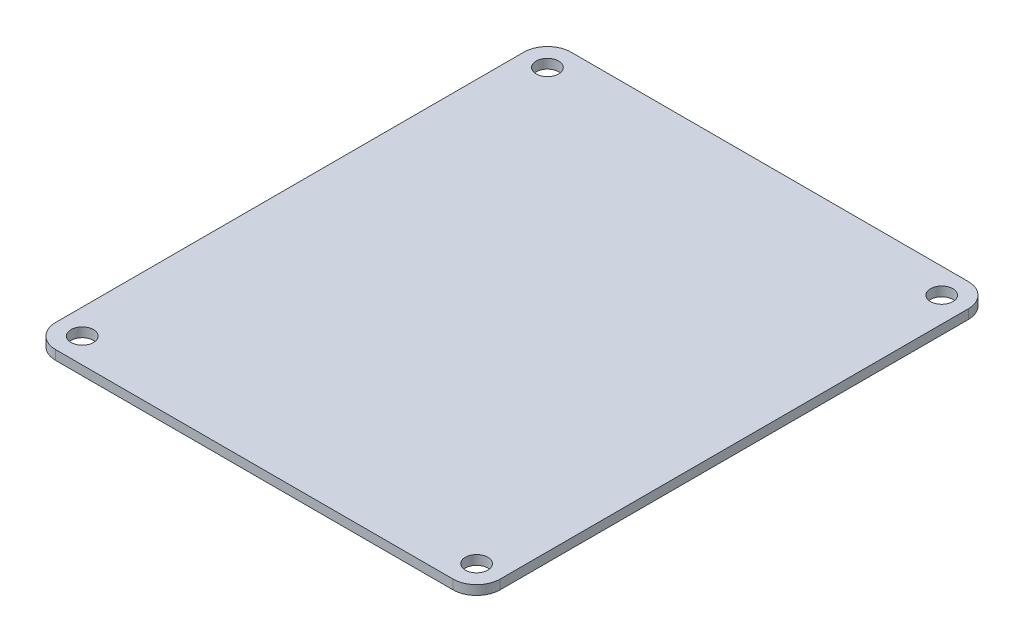
ISO-10303-21;
HEADER;
FILE_DESCRIPTION(('STEP AP214'),'2;1');
FILE_NAME('part.step','',(''),(''),'','','');
FILE_SCHEMA(('AUTOMOTIVE_DESIGN { 1 0 10303 214 1 1 1 1 }'));
ENDSEC;
DATA;
#1=APPLICATION_CONTEXT('core data for automotive mechanical design processes');
#2=APPLICATION_PROTOCOL_DEFINITION('international standard','automotive_design',2000,#1);
#3=PRODUCT_CONTEXT('',#1,'mechanical');
#4=PRODUCT('Part','Part','',(#3));
#5=PRODUCT_RELATED_PRODUCT_CATEGORY('part','',(#4));
#6=PRODUCT_DEFINITION_FORMATION('','',#4);
#7=PRODUCT_DEFINITION_CONTEXT('part definition',#1,'design');
#8=PRODUCT_DEFINITION('design','',#6,#7);
#9=PRODUCT_DEFINITION_SHAPE('','',#8);
#10=(LENGTH_UNIT() NAMED_UNIT(*) SI_UNIT(.MILLI.,.METRE.));
#11=(NAMED_UNIT(*) PLANE_ANGLE_UNIT() SI_UNIT($,.RADIAN.));
#12=(NAMED_UNIT(*) SI_UNIT($,.STERADIAN.) SOLID_ANGLE_UNIT());
#13=UNCERTAINTY_MEASURE_WITH_UNIT(LENGTH_MEASURE(1.E-05),#10,'distance_accuracy_value','');
#14=(GEOMETRIC_REPRESENTATION_CONTEXT(3) GLOBAL_UNCERTAINTY_ASSIGNED_CONTEXT((#13)) GLOBAL_UNIT_ASSIGNED_CONTEXT((#10,
#11,#12)) REPRESENTATION_CONTEXT('',''));
#15=CARTESIAN_POINT('',(0.,0.,0.));
#16=DIRECTION('',(0.,0.,1.));
#17=DIRECTION('',(1.,0.,0.));
#18=AXIS2_PLACEMENT_3D('',#15,#16,#17);
#19=CARTESIAN_POINT('',(-37.65,1.5875,-11.2851817770234));
#20=DIRECTION('',(1.,0.,0.));
#21=DIRECTION('',(0.,0.,-1.));
#22=AXIS2_PLACEMENT_3D('',#19,#20,#21);
#23=PLANE('',#22);
#24=DIRECTION('',(0.,0.,1.));
#25=VECTOR('',#24,1.);
#26=CARTESIAN_POINT('',(-37.65,0.,-11.2851817770234));
#27=LINE('',#26,#25);
#28=CARTESIAN_POINT('',(-37.65,0.,-7.28518177702344));
#29=VERTEX_POINT('',#28);
#30=CARTESIAN_POINT('',(-37.65,0.,72.0148182229765));
#31=VERTEX_POINT('',#30);
#32=EDGE_CURVE('E130',#29,#31,#27,.T.);
#33=ORIENTED_EDGE('',*,*,#32,.T.);
#34=DIRECTION('',(0.,-1.,0.));
#35=VECTOR('',#34,1.);
#36=CARTESIAN_POINT('',(-37.65,1.5875,72.0148182229765));
#37=LINE('',#36,#35);
#38=CARTESIAN_POINT('',(-37.65,1.5875,72.0148182229765));
#39=VERTEX_POINT('',#38);
#40=EDGE_CURVE('E152',#31,#39,#37,.F.);
#41=ORIENTED_EDGE('',*,*,#40,.T.);
#42=DIRECTION('',(0.,0.,1.));
#43=VECTOR('',#42,1.);
#44=CARTESIAN_POINT('',(-37.65,1.5875,-11.2851817770234));
#45=LINE('',#44,#43);
#46=CARTESIAN_POINT('',(-37.65,1.5875,-7.28518177702344));
#47=VERTEX_POINT('',#46);
#48=EDGE_CURVE('E128',#47,#39,#45,.T.);
#49=ORIENTED_EDGE('',*,*,#48,.F.);
#50=DIRECTION('',(0.,-1.,0.));
#51=VECTOR('',#50,1.);
#52=CARTESIAN_POINT('',(-37.65,1.5875,-7.28518177702344));
#53=LINE('',#52,#51);
#54=EDGE_CURVE('E149',#47,#29,#53,.T.);
#55=ORIENTED_EDGE('',*,*,#54,.T.);
#56=EDGE_LOOP('',(#33,#41,#49,#55));
#57=FACE_BOUND('',#56,.T.);
#58=ADVANCED_FACE('F33',(#57),#23,.F.);
#59=CARTESIAN_POINT('',(-37.65,1.5875,76.0148182229765));
#60=DIRECTION('',(0.,0.,-1.));
#61=DIRECTION('',(-1.,0.,0.));
#62=AXIS2_PLACEMENT_3D('',#59,#60,#61);
#63=PLANE('',#62);
#64=DIRECTION('',(1.,0.,0.));
#65=VECTOR('',#64,1.);
#66=CARTESIAN_POINT('',(-37.65,0.,76.0148182229765));
#67=LINE('',#66,#65);
#68=CARTESIAN_POINT('',(-33.65,0.,76.0148182229765));
#69=VERTEX_POINT('',#68);
#70=CARTESIAN_POINT('',(33.65,0.,76.0148182229765));
#71=VERTEX_POINT('',#70);
#72=EDGE_CURVE('E126',#69,#71,#67,.T.);
#73=ORIENTED_EDGE('',*,*,#72,.T.);
#74=DIRECTION('',(0.,-1.,0.));
#75=VECTOR('',#74,1.);
#76=CARTESIAN_POINT('',(33.65,1.5875,76.0148182229765));
#77=LINE('',#76,#75);
#78=CARTESIAN_POINT('',(33.65,1.5875,76.0148182229765));
#79=VERTEX_POINT('',#78);
#80=EDGE_CURVE('E104',#71,#79,#77,.F.);
#81=ORIENTED_EDGE('',*,*,#80,.T.);
#82=DIRECTION('',(1.,0.,0.));
#83=VECTOR('',#82,1.);
#84=CARTESIAN_POINT('',(-37.65,1.5875,76.0148182229765));
#85=LINE('',#84,#83);
#86=CARTESIAN_POINT('',(-33.65,1.5875,76.0148182229765));
#87=VERTEX_POINT('',#86);
#88=EDGE_CURVE('E166',#87,#79,#85,.T.);
#89=ORIENTED_EDGE('',*,*,#88,.F.);
#90=DIRECTION('',(0.,-1.,0.));
#91=VECTOR('',#90,1.);
#92=CARTESIAN_POINT('',(-33.65,1.5875,76.0148182229765));
#93=LINE('',#92,#91);
#94=EDGE_CURVE('E109',#87,#69,#93,.T.);
#95=ORIENTED_EDGE('',*,*,#94,.T.);
#96=EDGE_LOOP('',(#73,#81,#89,#95));
#97=FACE_BOUND('',#96,.T.);
#98=ADVANCED_FACE('F171',(#97),#63,.F.);
#99=CARTESIAN_POINT('',(37.65,1.5875,-11.2851817770234));
#100=DIRECTION('',(-1.,0.,0.));
#101=DIRECTION('',(0.,0.,1.));
#102=AXIS2_PLACEMENT_3D('',#99,#100,#101);
#103=PLANE('',#102);
#104=DIRECTION('',(0.,0.,-1.));
#105=VECTOR('',#104,1.);
#106=CARTESIAN_POINT('',(37.65,1.5875,-11.2851817770234));
#107=LINE('',#106,#105);
#108=CARTESIAN_POINT('',(37.65,1.5875,72.0148182229765));
#109=VERTEX_POINT('',#108);
#110=CARTESIAN_POINT('',(37.65,1.5875,-7.28518177702344));
#111=VERTEX_POINT('',#110);
#112=EDGE_CURVE('E118',#109,#111,#107,.T.);
#113=ORIENTED_EDGE('',*,*,#112,.F.);
#114=DIRECTION('',(0.,-1.,0.));
#115=VECTOR('',#114,1.);
#116=CARTESIAN_POINT('',(37.65,1.5875,72.0148182229765));
#117=LINE('',#116,#115);
#118=CARTESIAN_POINT('',(37.65,0.,72.0148182229765));
#119=VERTEX_POINT('',#118);
#120=EDGE_CURVE('E103',#109,#119,#117,.T.);
#121=ORIENTED_EDGE('',*,*,#120,.T.);
#122=DIRECTION('',(0.,0.,-1.));
#123=VECTOR('',#122,1.);
#124=CARTESIAN_POINT('',(37.65,0.,-11.2851817770234));
#125=LINE('',#124,#123);
#126=CARTESIAN_POINT('',(37.65,0.,-7.28518177702344));
#127=VERTEX_POINT('',#126);
#128=EDGE_CURVE('E116',#119,#127,#125,.T.);
#129=ORIENTED_EDGE('',*,*,#128,.T.);
#130=DIRECTION('',(0.,-1.,0.));
#131=VECTOR('',#130,1.);
#132=CARTESIAN_POINT('',(37.65,1.5875,-7.28518177702344));
#133=LINE('',#132,#131);
#134=EDGE_CURVE('E120',#127,#111,#133,.F.);
#135=ORIENTED_EDGE('',*,*,#134,.T.);
#136=EDGE_LOOP('',(#113,#121,#129,#135));
#137=FACE_BOUND('',#136,.T.);
#138=ADVANCED_FACE('F115',(#137),#103,.F.);
#139=CARTESIAN_POINT('',(-37.65,1.5875,-11.2851817770234));
#140=DIRECTION('',(0.,0.,1.));
#141=DIRECTION('',(1.,0.,0.));
#142=AXIS2_PLACEMENT_3D('',#139,#140,#141);
#143=PLANE('',#142);
#144=DIRECTION('',(-1.,0.,0.));
#145=VECTOR('',#144,1.);
#146=CARTESIAN_POINT('',(-37.65,1.5875,-11.2851817770234));
#147=LINE('',#146,#145);
#148=CARTESIAN_POINT('',(33.65,1.5875,-11.2851817770234));
#149=VERTEX_POINT('',#148);
#150=CARTESIAN_POINT('',(-33.65,1.5875,-11.2851817770234));
#151=VERTEX_POINT('',#150);
#152=EDGE_CURVE('E134',#149,#151,#147,.T.);
#153=ORIENTED_EDGE('',*,*,#152,.F.);
#154=DIRECTION('',(0.,-1.,0.));
#155=VECTOR('',#154,1.);
#156=CARTESIAN_POINT('',(33.65,1.5875,-11.2851817770234));
#157=LINE('',#156,#155);
#158=CARTESIAN_POINT('',(33.65,0.,-11.2851817770234));
#159=VERTEX_POINT('',#158);
#160=EDGE_CURVE('E11',#149,#159,#157,.T.);
#161=ORIENTED_EDGE('',*,*,#160,.T.);
#162=DIRECTION('',(-1.,0.,0.));
#163=VECTOR('',#162,1.);
#164=CARTESIAN_POINT('',(-37.65,0.,-11.2851817770234));
#165=LINE('',#164,#163);
#166=CARTESIAN_POINT('',(-33.65,0.,-11.2851817770234));
#167=VERTEX_POINT('',#166);
#168=EDGE_CURVE('E125',#159,#167,#165,.T.);
#169=ORIENTED_EDGE('',*,*,#168,.T.);
#170=DIRECTION('',(0.,-1.,0.));
#171=VECTOR('',#170,1.);
#172=CARTESIAN_POINT('',(-33.65,1.5875,-11.2851817770234));
#173=LINE('',#172,#171);
#174=EDGE_CURVE('E41',#167,#151,#173,.F.);
#175=ORIENTED_EDGE('',*,*,#174,.T.);
#176=EDGE_LOOP('',(#153,#161,#169,#175));
#177=FACE_BOUND('',#176,.T.);
#178=ADVANCED_FACE('F213',(#177),#143,.F.);
#179=CARTESIAN_POINT('',(0.,1.5875,0.));
#180=DIRECTION('',(0.,1.,0.));
#181=DIRECTION('',(0.,0.,1.));
#182=AXIS2_PLACEMENT_3D('',#179,#180,#181);
#183=PLANE('',#182);
#184=CARTESIAN_POINT('',(33.4,1.5875,-7.03518177702345));
#185=DIRECTION('',(0.,1.,0.));
#186=DIRECTION('',(0.,0.,1.));
#187=AXIS2_PLACEMENT_3D('',#184,#185,#186);
#188=CIRCLE('',#187,1.9);
#189=CARTESIAN_POINT('',(33.4,1.5875,-5.13518177702345));
#190=VERTEX_POINT('',#189);
#191=EDGE_CURVE('E183',#190,#190,#188,.T.);
#192=ORIENTED_EDGE('',*,*,#191,.F.);
#193=EDGE_LOOP('',(#192));
#194=FACE_BOUND('',#193,.T.);
#195=CARTESIAN_POINT('',(-33.4,1.5875,-7.03518177702344));
#196=DIRECTION('',(0.,1.,0.));
#197=DIRECTION('',(0.,0.,1.));
#198=AXIS2_PLACEMENT_3D('',#195,#196,#197);
#199=CIRCLE('',#198,1.9);
#200=CARTESIAN_POINT('',(-33.4,1.5875,-5.13518177702344));
#201=VERTEX_POINT('',#200);
#202=EDGE_CURVE('E190',#201,#201,#199,.T.);
#203=ORIENTED_EDGE('',*,*,#202,.F.);
#204=EDGE_LOOP('',(#203));
#205=FACE_BOUND('',#204,.T.);
#206=CARTESIAN_POINT('',(-33.4,1.5875,71.7648182229765));
#207=DIRECTION('',(0.,1.,0.));
#208=DIRECTION('',(0.,0.,1.));
#209=AXIS2_PLACEMENT_3D('',#206,#207,#208);
#210=CIRCLE('',#209,1.9);
#211=CARTESIAN_POINT('',(-33.4,1.5875,73.6648182229765));
#212=VERTEX_POINT('',#211);
#213=EDGE_CURVE('E182',#212,#212,#210,.T.);
#214=ORIENTED_EDGE('',*,*,#213,.F.);
#215=EDGE_LOOP('',(#214));
#216=FACE_BOUND('',#215,.T.);
#217=CARTESIAN_POINT('',(33.4,1.5875,71.7648182229766));
#218=DIRECTION('',(0.,1.,0.));
#219=DIRECTION('',(0.,0.,1.));
#220=AXIS2_PLACEMENT_3D('',#217,#218,#219);
#221=CIRCLE('',#220,1.90000000000001);
#222=CARTESIAN_POINT('',(33.4,1.5875,73.6648182229766));
#223=VERTEX_POINT('',#222);
#224=EDGE_CURVE('E172',#223,#223,#221,.T.);
#225=ORIENTED_EDGE('',*,*,#224,.F.);
#226=EDGE_LOOP('',(#225));
#227=FACE_BOUND('',#226,.T.);
#228=ORIENTED_EDGE('',*,*,#88,.T.);
#229=CARTESIAN_POINT('',(33.65,1.5875,72.0148182229765));
#230=DIRECTION('',(0.,1.,0.));
#231=DIRECTION('',(0.,0.,1.));
#232=AXIS2_PLACEMENT_3D('',#229,#230,#231);
#233=CIRCLE('',#232,4.);
#234=EDGE_CURVE('E147',#79,#109,#233,.T.);
#235=ORIENTED_EDGE('',*,*,#234,.T.);
#236=ORIENTED_EDGE('',*,*,#112,.T.);
#237=CARTESIAN_POINT('',(33.65,1.5875,-7.28518177702344));
#238=DIRECTION('',(0.,1.,0.));
#239=DIRECTION('',(0.,0.,1.));
#240=AXIS2_PLACEMENT_3D('',#237,#238,#239);
#241=CIRCLE('',#240,4.);
#242=EDGE_CURVE('E54',#111,#149,#241,.T.);
#243=ORIENTED_EDGE('',*,*,#242,.T.);
#244=ORIENTED_EDGE('',*,*,#152,.T.);
#245=CARTESIAN_POINT('',(-33.65,1.5875,-7.28518177702344));
#246=DIRECTION('',(0.,1.,0.));
#247=DIRECTION('',(0.,0.,1.));
#248=AXIS2_PLACEMENT_3D('',#245,#246,#247);
#249=CIRCLE('',#248,4.);
#250=EDGE_CURVE('E142',#151,#47,#249,.T.);
#251=ORIENTED_EDGE('',*,*,#250,.T.);
#252=ORIENTED_EDGE('',*,*,#48,.T.);
#253=CARTESIAN_POINT('',(-33.65,1.5875,72.0148182229765));
#254=DIRECTION('',(0.,1.,0.));
#255=DIRECTION('',(0.,0.,1.));
#256=AXIS2_PLACEMENT_3D('',#253,#254,#255);
#257=CIRCLE('',#256,4.);
#258=EDGE_CURVE('E145',#39,#87,#257,.T.);
#259=ORIENTED_EDGE('',*,*,#258,.T.);
#260=EDGE_LOOP('',(#228,#235,#236,#243,#244,#251,#252,#259));
#261=FACE_BOUND('',#260,.T.);
#262=ADVANCED_FACE('F163',(#194,#205,#216,#227,#261),#183,.T.);
#263=CARTESIAN_POINT('',(0.,0.,0.));
#264=DIRECTION('',(0.,1.,0.));
#265=DIRECTION('',(0.,0.,1.));
#266=AXIS2_PLACEMENT_3D('',#263,#264,#265);
#267=PLANE('',#266);
#268=CARTESIAN_POINT('',(33.4,0.,-7.03518177702345));
#269=DIRECTION('',(0.,1.,0.));
#270=DIRECTION('',(0.,0.,1.));
#271=AXIS2_PLACEMENT_3D('',#268,#269,#270);
#272=CIRCLE('',#271,1.9);
#273=CARTESIAN_POINT('',(33.4,0.,-5.13518177702345));
#274=VERTEX_POINT('',#273);
#275=EDGE_CURVE('E187',#274,#274,#272,.T.);
#276=ORIENTED_EDGE('',*,*,#275,.T.);
#277=EDGE_LOOP('',(#276));
#278=FACE_BOUND('',#277,.T.);
#279=CARTESIAN_POINT('',(-33.4,0.,-7.03518177702344));
#280=DIRECTION('',(0.,1.,0.));
#281=DIRECTION('',(0.,0.,1.));
#282=AXIS2_PLACEMENT_3D('',#279,#280,#281);
#283=CIRCLE('',#282,1.9);
#284=CARTESIAN_POINT('',(-33.4,0.,-5.13518177702344));
#285=VERTEX_POINT('',#284);
#286=EDGE_CURVE('E186',#285,#285,#283,.T.);
#287=ORIENTED_EDGE('',*,*,#286,.T.);
#288=EDGE_LOOP('',(#287));
#289=FACE_BOUND('',#288,.T.);
#290=CARTESIAN_POINT('',(-33.4,0.,71.7648182229765));
#291=DIRECTION('',(0.,1.,0.));
#292=DIRECTION('',(0.,0.,1.));
#293=AXIS2_PLACEMENT_3D('',#290,#291,#292);
#294=CIRCLE('',#293,1.9);
#295=CARTESIAN_POINT('',(-33.4,0.,73.6648182229765));
#296=VERTEX_POINT('',#295);
#297=EDGE_CURVE('E193',#296,#296,#294,.T.);
#298=ORIENTED_EDGE('',*,*,#297,.T.);
#299=EDGE_LOOP('',(#298));
#300=FACE_BOUND('',#299,.T.);
#301=CARTESIAN_POINT('',(33.4,0.,71.7648182229766));
#302=DIRECTION('',(0.,1.,0.));
#303=DIRECTION('',(0.,0.,1.));
#304=AXIS2_PLACEMENT_3D('',#301,#302,#303);
#305=CIRCLE('',#304,1.90000000000001);
#306=CARTESIAN_POINT('',(33.4,0.,73.6648182229766));
#307=VERTEX_POINT('',#306);
#308=EDGE_CURVE('E174',#307,#307,#305,.T.);
#309=ORIENTED_EDGE('',*,*,#308,.T.);
#310=EDGE_LOOP('',(#309));
#311=FACE_BOUND('',#310,.T.);
#312=ORIENTED_EDGE('',*,*,#128,.F.);
#313=CARTESIAN_POINT('',(33.65,0.,72.0148182229765));
#314=DIRECTION('',(0.,1.,0.));
#315=DIRECTION('',(0.,0.,1.));
#316=AXIS2_PLACEMENT_3D('',#313,#314,#315);
#317=CIRCLE('',#316,4.);
#318=EDGE_CURVE('E99',#119,#71,#317,.F.);
#319=ORIENTED_EDGE('',*,*,#318,.T.);
#320=ORIENTED_EDGE('',*,*,#72,.F.);
#321=CARTESIAN_POINT('',(-33.65,0.,72.0148182229765));
#322=DIRECTION('',(0.,1.,0.));
#323=DIRECTION('',(0.,0.,1.));
#324=AXIS2_PLACEMENT_3D('',#321,#322,#323);
#325=CIRCLE('',#324,4.);
#326=EDGE_CURVE('E110',#69,#31,#325,.F.);
#327=ORIENTED_EDGE('',*,*,#326,.T.);
#328=ORIENTED_EDGE('',*,*,#32,.F.);
#329=CARTESIAN_POINT('',(-33.65,0.,-7.28518177702344));
#330=DIRECTION('',(0.,1.,0.));
#331=DIRECTION('',(0.,0.,1.));
#332=AXIS2_PLACEMENT_3D('',#329,#330,#331);
#333=CIRCLE('',#332,4.);
#334=EDGE_CURVE('E119',#29,#167,#333,.F.);
#335=ORIENTED_EDGE('',*,*,#334,.T.);
#336=ORIENTED_EDGE('',*,*,#168,.F.);
#337=CARTESIAN_POINT('',(33.65,0.,-7.28518177702344));
#338=DIRECTION('',(0.,1.,0.));
#339=DIRECTION('',(0.,0.,1.));
#340=AXIS2_PLACEMENT_3D('',#337,#338,#339);
#341=CIRCLE('',#340,4.);
#342=EDGE_CURVE('E124',#159,#127,#341,.F.);
#343=ORIENTED_EDGE('',*,*,#342,.T.);
#344=EDGE_LOOP('',(#312,#319,#320,#327,#328,#335,#336,#343));
#345=FACE_BOUND('',#344,.T.);
#346=ADVANCED_FACE('F122',(#278,#289,#300,#311,#345),#267,.F.);
#347=CARTESIAN_POINT('',(33.4,6.96151153701779,71.7648182229766));
#348=DIRECTION('',(0.,-1.,0.));
#349=DIRECTION('',(0.,0.,-1.));
#350=AXIS2_PLACEMENT_3D('',#347,#348,#349);
#351=CYLINDRICAL_SURFACE('',#350,1.90000000000001);
#352=ORIENTED_EDGE('',*,*,#308,.F.);
#353=EDGE_LOOP('',(#352));
#354=FACE_BOUND('',#353,.T.);
#355=ORIENTED_EDGE('',*,*,#224,.T.);
#356=EDGE_LOOP('',(#355));
#357=FACE_BOUND('',#356,.T.);
#358=ADVANCED_FACE('F207',(#354,#357),#351,.F.);
#359=CARTESIAN_POINT('',(-33.4,6.96151153701779,71.7648182229765));
#360=DIRECTION('',(0.,-1.,0.));
#361=DIRECTION('',(0.,0.,-1.));
#362=AXIS2_PLACEMENT_3D('',#359,#360,#361);
#363=CYLINDRICAL_SURFACE('',#362,1.9);
#364=ORIENTED_EDGE('',*,*,#297,.F.);
#365=EDGE_LOOP('',(#364));
#366=FACE_BOUND('',#365,.T.);
#367=ORIENTED_EDGE('',*,*,#213,.T.);
#368=EDGE_LOOP('',(#367));
#369=FACE_BOUND('',#368,.T.);
#370=ADVANCED_FACE('F203',(#366,#369),#363,.F.);
#371=CARTESIAN_POINT('',(-33.4,6.96151153701779,-7.03518177702344));
#372=DIRECTION('',(0.,-1.,0.));
#373=DIRECTION('',(0.,0.,-1.));
#374=AXIS2_PLACEMENT_3D('',#371,#372,#373);
#375=CYLINDRICAL_SURFACE('',#374,1.9);
#376=ORIENTED_EDGE('',*,*,#286,.F.);
#377=EDGE_LOOP('',(#376));
#378=FACE_BOUND('',#377,.T.);
#379=ORIENTED_EDGE('',*,*,#202,.T.);
#380=EDGE_LOOP('',(#379));
#381=FACE_BOUND('',#380,.T.);
#382=ADVANCED_FACE('F206',(#378,#381),#375,.F.);
#383=CARTESIAN_POINT('',(33.4,6.96151153701779,-7.03518177702345));
#384=DIRECTION('',(0.,-1.,0.));
#385=DIRECTION('',(0.,0.,-1.));
#386=AXIS2_PLACEMENT_3D('',#383,#384,#385);
#387=CYLINDRICAL_SURFACE('',#386,1.9);
#388=ORIENTED_EDGE('',*,*,#275,.F.);
#389=EDGE_LOOP('',(#388));
#390=FACE_BOUND('',#389,.T.);
#391=ORIENTED_EDGE('',*,*,#191,.T.);
#392=EDGE_LOOP('',(#391));
#393=FACE_BOUND('',#392,.T.);
#394=ADVANCED_FACE('F238',(#390,#393),#387,.F.);
#395=CARTESIAN_POINT('',(33.65,1.5875,72.0148182229765));
#396=DIRECTION('',(0.,-1.,0.));
#397=DIRECTION('',(0.,0.,-1.));
#398=AXIS2_PLACEMENT_3D('',#395,#396,#397);
#399=CYLINDRICAL_SURFACE('',#398,4.);
#400=ORIENTED_EDGE('',*,*,#234,.F.);
#401=ORIENTED_EDGE('',*,*,#80,.F.);
#402=ORIENTED_EDGE('',*,*,#318,.F.);
#403=ORIENTED_EDGE('',*,*,#120,.F.);
#404=EDGE_LOOP('',(#400,#401,#402,#403));
#405=FACE_BOUND('',#404,.T.);
#406=ADVANCED_FACE('F102',(#405),#399,.T.);
#407=CARTESIAN_POINT('',(-33.65,1.5875,72.0148182229765));
#408=DIRECTION('',(0.,-1.,0.));
#409=DIRECTION('',(0.,0.,-1.));
#410=AXIS2_PLACEMENT_3D('',#407,#408,#409);
#411=CYLINDRICAL_SURFACE('',#410,4.);
#412=ORIENTED_EDGE('',*,*,#258,.F.);
#413=ORIENTED_EDGE('',*,*,#40,.F.);
#414=ORIENTED_EDGE('',*,*,#326,.F.);
#415=ORIENTED_EDGE('',*,*,#94,.F.);
#416=EDGE_LOOP('',(#412,#413,#414,#415));
#417=FACE_BOUND('',#416,.T.);
#418=ADVANCED_FACE('F169',(#417),#411,.T.);
#419=CARTESIAN_POINT('',(33.65,1.5875,-7.28518177702344));
#420=DIRECTION('',(0.,-1.,0.));
#421=DIRECTION('',(0.,0.,-1.));
#422=AXIS2_PLACEMENT_3D('',#419,#420,#421);
#423=CYLINDRICAL_SURFACE('',#422,4.);
#424=ORIENTED_EDGE('',*,*,#242,.F.);
#425=ORIENTED_EDGE('',*,*,#134,.F.);
#426=ORIENTED_EDGE('',*,*,#342,.F.);
#427=ORIENTED_EDGE('',*,*,#160,.F.);
#428=EDGE_LOOP('',(#424,#425,#426,#427));
#429=FACE_BOUND('',#428,.T.);
#430=ADVANCED_FACE('F240',(#429),#423,.T.);
#431=CARTESIAN_POINT('',(-33.65,1.5875,-7.28518177702344));
#432=DIRECTION('',(0.,-1.,0.));
#433=DIRECTION('',(0.,0.,-1.));
#434=AXIS2_PLACEMENT_3D('',#431,#432,#433);
#435=CYLINDRICAL_SURFACE('',#434,4.);
#436=ORIENTED_EDGE('',*,*,#250,.F.);
#437=ORIENTED_EDGE('',*,*,#174,.F.);
#438=ORIENTED_EDGE('',*,*,#334,.F.);
#439=ORIENTED_EDGE('',*,*,#54,.F.);
#440=EDGE_LOOP('',(#436,#437,#438,#439));
#441=FACE_BOUND('',#440,.T.);
#442=ADVANCED_FACE('F35',(#441),#435,.T.);
#443=CLOSED_SHELL('',(#58,#98,#138,#178,#262,#346,#358,#370,#382,#394,#406,#418,#430,#442));
#444=MANIFOLD_SOLID_BREP('B2',#443);
#445=ADVANCED_BREP_SHAPE_REPRESENTATION('',(#18,#444),#14);
#446=SHAPE_DEFINITION_REPRESENTATION(#9,#445);
ENDSEC;
END-ISO-10303-21;
